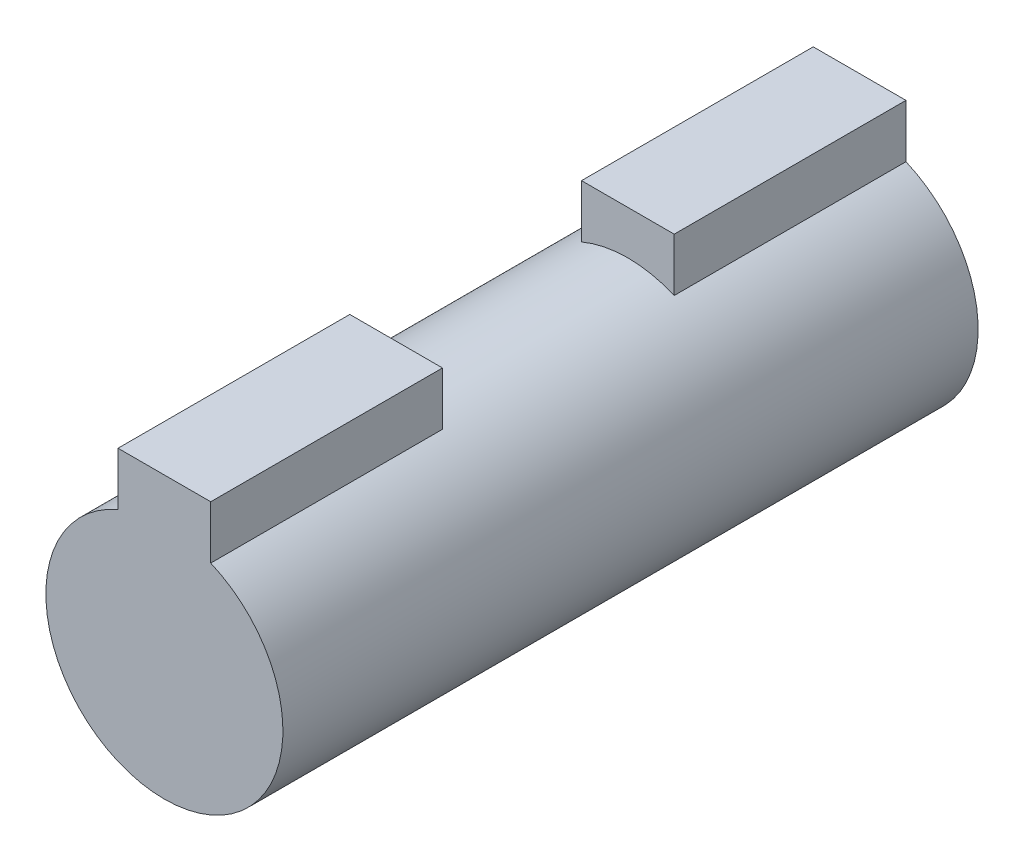
ISO-10303-21;
HEADER;
FILE_DESCRIPTION(('STEP AP214'),'2;1');
FILE_NAME('part.step','',(''),(''),'','','');
FILE_SCHEMA(('AUTOMOTIVE_DESIGN { 1 0 10303 214 1 1 1 1 }'));
ENDSEC;
DATA;
#1=APPLICATION_CONTEXT('core data for automotive mechanical design processes');
#2=APPLICATION_PROTOCOL_DEFINITION('international standard','automotive_design',2000,#1);
#3=PRODUCT_CONTEXT('',#1,'mechanical');
#4=PRODUCT('Part','Part','',(#3));
#5=PRODUCT_RELATED_PRODUCT_CATEGORY('part','',(#4));
#6=PRODUCT_DEFINITION_FORMATION('','',#4);
#7=PRODUCT_DEFINITION_CONTEXT('part definition',#1,'design');
#8=PRODUCT_DEFINITION('design','',#6,#7);
#9=PRODUCT_DEFINITION_SHAPE('','',#8);
#10=(LENGTH_UNIT() NAMED_UNIT(*) SI_UNIT(.MILLI.,.METRE.));
#11=(NAMED_UNIT(*) PLANE_ANGLE_UNIT() SI_UNIT($,.RADIAN.));
#12=(NAMED_UNIT(*) SI_UNIT($,.STERADIAN.) SOLID_ANGLE_UNIT());
#13=UNCERTAINTY_MEASURE_WITH_UNIT(LENGTH_MEASURE(1.E-05),#10,'distance_accuracy_value','');
#14=(GEOMETRIC_REPRESENTATION_CONTEXT(3) GLOBAL_UNCERTAINTY_ASSIGNED_CONTEXT((#13)) GLOBAL_UNIT_ASSIGNED_CONTEXT((#10,
#11,#12)) REPRESENTATION_CONTEXT('',''));
#15=CARTESIAN_POINT('',(0.,0.,0.));
#16=DIRECTION('',(0.,0.,1.));
#17=DIRECTION('',(1.,0.,0.));
#18=AXIS2_PLACEMENT_3D('',#15,#16,#17);
#19=CARTESIAN_POINT('',(2.00000000000002,7.00000000000001,30.));
#20=DIRECTION('',(-1.,0.,0.));
#21=DIRECTION('',(0.,-1.,0.));
#22=AXIS2_PLACEMENT_3D('',#19,#20,#21);
#23=PLANE('',#22);
#24=DIRECTION('',(0.,1.,0.));
#25=VECTOR('',#24,1.);
#26=CARTESIAN_POINT('',(2.00000000000001,7.00000000000001,9.99999999999999));
#27=LINE('',#26,#25);
#28=CARTESIAN_POINT('',(2.00000000000001,4.70724019463636,9.99999999999999));
#29=VERTEX_POINT('',#28);
#30=CARTESIAN_POINT('',(2.00000000000001,7.00000000000001,9.99999999999999));
#31=VERTEX_POINT('',#30);
#32=EDGE_CURVE('E162',#29,#31,#27,.T.);
#33=ORIENTED_EDGE('',*,*,#32,.F.);
#34=DIRECTION('',(0.,0.,-1.));
#35=VECTOR('',#34,1.);
#36=CARTESIAN_POINT('',(2.00000000000001,4.70724019463636,30.));
#37=LINE('',#36,#35);
#38=CARTESIAN_POINT('',(2.00000000000001,4.70724019463634,0.));
#39=VERTEX_POINT('',#38);
#40=EDGE_CURVE('E78',#29,#39,#37,.T.);
#41=ORIENTED_EDGE('',*,*,#40,.T.);
#42=DIRECTION('',(0.,1.,0.));
#43=VECTOR('',#42,1.);
#44=CARTESIAN_POINT('',(1.99999999999999,7.,0.));
#45=LINE('',#44,#43);
#46=CARTESIAN_POINT('',(1.99999999999999,7.,0.));
#47=VERTEX_POINT('',#46);
#48=EDGE_CURVE('E157',#39,#47,#45,.T.);
#49=ORIENTED_EDGE('',*,*,#48,.T.);
#50=DIRECTION('',(0.,0.,-1.));
#51=VECTOR('',#50,1.);
#52=CARTESIAN_POINT('',(2.00000000000002,7.00000000000001,30.));
#53=LINE('',#52,#51);
#54=EDGE_CURVE('E42',#31,#47,#53,.T.);
#55=ORIENTED_EDGE('',*,*,#54,.F.);
#56=EDGE_LOOP('',(#33,#41,#49,#55));
#57=FACE_BOUND('',#56,.T.);
#58=ADVANCED_FACE('F34',(#57),#23,.F.);
#59=CARTESIAN_POINT('',(2.00000000000002,7.00000000000001,30.));
#60=DIRECTION('',(0.,-1.,0.));
#61=DIRECTION('',(0.,0.,-1.));
#62=AXIS2_PLACEMENT_3D('',#59,#60,#61);
#63=PLANE('',#62);
#64=DIRECTION('',(-1.,0.,0.));
#65=VECTOR('',#64,1.);
#66=CARTESIAN_POINT('',(2.00000000000001,7.00000000000001,9.99999999999999));
#67=LINE('',#66,#65);
#68=CARTESIAN_POINT('',(-1.99999999999999,7.00000000000002,9.99999999999999));
#69=VERTEX_POINT('',#68);
#70=EDGE_CURVE('E169',#31,#69,#67,.T.);
#71=ORIENTED_EDGE('',*,*,#70,.F.);
#72=ORIENTED_EDGE('',*,*,#54,.T.);
#73=DIRECTION('',(-1.,0.,0.));
#74=VECTOR('',#73,1.);
#75=CARTESIAN_POINT('',(1.99999999999999,7.,0.));
#76=LINE('',#75,#74);
#77=CARTESIAN_POINT('',(-2.,7.,0.));
#78=VERTEX_POINT('',#77);
#79=EDGE_CURVE('E152',#47,#78,#76,.T.);
#80=ORIENTED_EDGE('',*,*,#79,.T.);
#81=DIRECTION('',(0.,0.,-1.));
#82=VECTOR('',#81,1.);
#83=CARTESIAN_POINT('',(-2.,7.00000000000001,30.));
#84=LINE('',#83,#82);
#85=EDGE_CURVE('E134',#69,#78,#84,.T.);
#86=ORIENTED_EDGE('',*,*,#85,.F.);
#87=EDGE_LOOP('',(#71,#72,#80,#86));
#88=FACE_BOUND('',#87,.T.);
#89=ADVANCED_FACE('F153',(#88),#63,.F.);
#90=CARTESIAN_POINT('',(-2.,7.00000000000001,30.));
#91=DIRECTION('',(1.,0.,0.));
#92=DIRECTION('',(0.,1.,0.));
#93=AXIS2_PLACEMENT_3D('',#90,#91,#92);
#94=PLANE('',#93);
#95=DIRECTION('',(0.,-1.,0.));
#96=VECTOR('',#95,1.);
#97=CARTESIAN_POINT('',(-1.99999999999999,7.00000000000002,9.99999999999999));
#98=LINE('',#97,#96);
#99=CARTESIAN_POINT('',(-2.,4.70724019463636,9.99999999999999));
#100=VERTEX_POINT('',#99);
#101=EDGE_CURVE('E117',#69,#100,#98,.T.);
#102=ORIENTED_EDGE('',*,*,#101,.F.);
#103=ORIENTED_EDGE('',*,*,#85,.T.);
#104=DIRECTION('',(0.,-1.,0.));
#105=VECTOR('',#104,1.);
#106=CARTESIAN_POINT('',(-2.,7.,0.));
#107=LINE('',#106,#105);
#108=CARTESIAN_POINT('',(-2.,4.70724019463636,0.));
#109=VERTEX_POINT('',#108);
#110=EDGE_CURVE('E147',#78,#109,#107,.T.);
#111=ORIENTED_EDGE('',*,*,#110,.T.);
#112=DIRECTION('',(0.,0.,-1.));
#113=VECTOR('',#112,1.);
#114=CARTESIAN_POINT('',(-2.,4.70724019463636,30.));
#115=LINE('',#114,#113);
#116=EDGE_CURVE('E128',#100,#109,#115,.T.);
#117=ORIENTED_EDGE('',*,*,#116,.F.);
#118=EDGE_LOOP('',(#102,#103,#111,#117));
#119=FACE_BOUND('',#118,.T.);
#120=ADVANCED_FACE('F144',(#119),#94,.F.);
#121=CARTESIAN_POINT('',(2.00000000000001,4.70724019463636,30.));
#122=VERTEX_POINT('',#121);
#123=CARTESIAN_POINT('',(2.,4.70724019463636,20.));
#124=VERTEX_POINT('',#123);
#125=EDGE_CURVE('E122',#122,#124,#37,.T.);
#126=ORIENTED_EDGE('',*,*,#125,.T.);
#127=DIRECTION('',(0.,1.,0.));
#128=VECTOR('',#127,1.);
#129=CARTESIAN_POINT('',(2.,7.00000000000003,20.));
#130=LINE('',#129,#128);
#131=CARTESIAN_POINT('',(2.,7.00000000000003,20.));
#132=VERTEX_POINT('',#131);
#133=EDGE_CURVE('E107',#124,#132,#130,.T.);
#134=ORIENTED_EDGE('',*,*,#133,.T.);
#135=CARTESIAN_POINT('',(2.00000000000002,7.00000000000001,30.));
#136=VERTEX_POINT('',#135);
#137=EDGE_CURVE('E11',#136,#132,#53,.T.);
#138=ORIENTED_EDGE('',*,*,#137,.F.);
#139=DIRECTION('',(0.,1.,0.));
#140=VECTOR('',#139,1.);
#141=CARTESIAN_POINT('',(2.00000000000002,7.00000000000001,30.));
#142=LINE('',#141,#140);
#143=EDGE_CURVE('E127',#122,#136,#142,.T.);
#144=ORIENTED_EDGE('',*,*,#143,.F.);
#145=EDGE_LOOP('',(#126,#134,#138,#144));
#146=FACE_BOUND('',#145,.T.);
#147=ADVANCED_FACE('F36',(#146),#23,.F.);
#148=ORIENTED_EDGE('',*,*,#137,.T.);
#149=DIRECTION('',(-1.,0.,0.));
#150=VECTOR('',#149,1.);
#151=CARTESIAN_POINT('',(2.,7.00000000000003,20.));
#152=LINE('',#151,#150);
#153=CARTESIAN_POINT('',(-2.,7.00000000000003,20.));
#154=VERTEX_POINT('',#153);
#155=EDGE_CURVE('E113',#132,#154,#152,.T.);
#156=ORIENTED_EDGE('',*,*,#155,.T.);
#157=CARTESIAN_POINT('',(-2.,7.00000000000001,30.));
#158=VERTEX_POINT('',#157);
#159=EDGE_CURVE('E135',#158,#154,#84,.T.);
#160=ORIENTED_EDGE('',*,*,#159,.F.);
#161=DIRECTION('',(-1.,0.,0.));
#162=VECTOR('',#161,1.);
#163=CARTESIAN_POINT('',(2.00000000000002,7.00000000000001,30.));
#164=LINE('',#163,#162);
#165=EDGE_CURVE('E85',#136,#158,#164,.T.);
#166=ORIENTED_EDGE('',*,*,#165,.F.);
#167=EDGE_LOOP('',(#148,#156,#160,#166));
#168=FACE_BOUND('',#167,.T.);
#169=ADVANCED_FACE('F176',(#168),#63,.F.);
#170=ORIENTED_EDGE('',*,*,#159,.T.);
#171=DIRECTION('',(0.,-1.,0.));
#172=VECTOR('',#171,1.);
#173=CARTESIAN_POINT('',(-2.,7.00000000000003,20.));
#174=LINE('',#173,#172);
#175=CARTESIAN_POINT('',(-2.,4.70724019463636,20.));
#176=VERTEX_POINT('',#175);
#177=EDGE_CURVE('E173',#154,#176,#174,.T.);
#178=ORIENTED_EDGE('',*,*,#177,.T.);
#179=CARTESIAN_POINT('',(-2.,4.70724019463636,30.));
#180=VERTEX_POINT('',#179);
#181=EDGE_CURVE('E125',#180,#176,#115,.T.);
#182=ORIENTED_EDGE('',*,*,#181,.F.);
#183=DIRECTION('',(0.,-1.,0.));
#184=VECTOR('',#183,1.);
#185=CARTESIAN_POINT('',(-2.,7.00000000000001,30.));
#186=LINE('',#185,#184);
#187=EDGE_CURVE('E164',#158,#180,#186,.T.);
#188=ORIENTED_EDGE('',*,*,#187,.F.);
#189=EDGE_LOOP('',(#170,#178,#182,#188));
#190=FACE_BOUND('',#189,.T.);
#191=ADVANCED_FACE('F175',(#190),#94,.F.);
#192=CARTESIAN_POINT('',(0.,0.,30.));
#193=DIRECTION('',(0.,0.,-1.));
#194=DIRECTION('',(-1.,0.,0.));
#195=AXIS2_PLACEMENT_3D('',#192,#193,#194);
#196=CYLINDRICAL_SURFACE('',#195,5.1145);
#197=ORIENTED_EDGE('',*,*,#40,.F.);
#198=CARTESIAN_POINT('',(0.,0.,9.99999999999999));
#199=DIRECTION('',(0.,0.,1.));
#200=DIRECTION('',(1.,0.,0.));
#201=AXIS2_PLACEMENT_3D('',#198,#199,#200);
#202=CIRCLE('',#201,5.1145);
#203=EDGE_CURVE('E49',#29,#100,#202,.T.);
#204=ORIENTED_EDGE('',*,*,#203,.T.);
#205=ORIENTED_EDGE('',*,*,#116,.T.);
#206=CARTESIAN_POINT('',(0.,0.,0.));
#207=DIRECTION('',(0.,0.,1.));
#208=DIRECTION('',(1.,0.,0.));
#209=AXIS2_PLACEMENT_3D('',#206,#207,#208);
#210=CIRCLE('',#209,5.1145);
#211=EDGE_CURVE('E132',#109,#39,#210,.T.);
#212=ORIENTED_EDGE('',*,*,#211,.T.);
#213=EDGE_LOOP('',(#197,#204,#205,#212));
#214=FACE_BOUND('',#213,.T.);
#215=ORIENTED_EDGE('',*,*,#181,.T.);
#216=CARTESIAN_POINT('',(0.,0.,20.));
#217=DIRECTION('',(0.,0.,1.));
#218=DIRECTION('',(1.,0.,0.));
#219=AXIS2_PLACEMENT_3D('',#216,#217,#218);
#220=CIRCLE('',#219,5.1145);
#221=EDGE_CURVE('E110',#124,#176,#220,.T.);
#222=ORIENTED_EDGE('',*,*,#221,.F.);
#223=ORIENTED_EDGE('',*,*,#125,.F.);
#224=CARTESIAN_POINT('',(0.,0.,30.));
#225=DIRECTION('',(0.,0.,1.));
#226=DIRECTION('',(1.,0.,0.));
#227=AXIS2_PLACEMENT_3D('',#224,#225,#226);
#228=CIRCLE('',#227,5.1145);
#229=EDGE_CURVE('E58',#180,#122,#228,.T.);
#230=ORIENTED_EDGE('',*,*,#229,.F.);
#231=EDGE_LOOP('',(#215,#222,#223,#230));
#232=FACE_BOUND('',#231,.T.);
#233=ADVANCED_FACE('F121',(#214,#232),#196,.T.);
#234=CARTESIAN_POINT('',(0.,0.,30.));
#235=DIRECTION('',(0.,0.,1.));
#236=DIRECTION('',(1.,0.,0.));
#237=AXIS2_PLACEMENT_3D('',#234,#235,#236);
#238=PLANE('',#237);
#239=ORIENTED_EDGE('',*,*,#143,.T.);
#240=ORIENTED_EDGE('',*,*,#165,.T.);
#241=ORIENTED_EDGE('',*,*,#187,.T.);
#242=ORIENTED_EDGE('',*,*,#229,.T.);
#243=EDGE_LOOP('',(#239,#240,#241,#242));
#244=FACE_BOUND('',#243,.T.);
#245=ADVANCED_FACE('F177',(#244),#238,.T.);
#246=CARTESIAN_POINT('',(0.,0.,0.));
#247=DIRECTION('',(0.,0.,1.));
#248=DIRECTION('',(1.,0.,0.));
#249=AXIS2_PLACEMENT_3D('',#246,#247,#248);
#250=PLANE('',#249);
#251=ORIENTED_EDGE('',*,*,#48,.F.);
#252=ORIENTED_EDGE('',*,*,#211,.F.);
#253=ORIENTED_EDGE('',*,*,#110,.F.);
#254=ORIENTED_EDGE('',*,*,#79,.F.);
#255=EDGE_LOOP('',(#251,#252,#253,#254));
#256=FACE_BOUND('',#255,.T.);
#257=ADVANCED_FACE('F159',(#256),#250,.F.);
#258=CARTESIAN_POINT('',(0.,0.,9.99999999999999));
#259=DIRECTION('',(0.,0.,1.));
#260=DIRECTION('',(1.,0.,0.));
#261=AXIS2_PLACEMENT_3D('',#258,#259,#260);
#262=PLANE('',#261);
#263=ORIENTED_EDGE('',*,*,#32,.T.);
#264=ORIENTED_EDGE('',*,*,#70,.T.);
#265=ORIENTED_EDGE('',*,*,#101,.T.);
#266=ORIENTED_EDGE('',*,*,#203,.F.);
#267=EDGE_LOOP('',(#263,#264,#265,#266));
#268=FACE_BOUND('',#267,.T.);
#269=ADVANCED_FACE('F184',(#268),#262,.T.);
#270=CARTESIAN_POINT('',(0.,0.,20.));
#271=DIRECTION('',(0.,0.,1.));
#272=DIRECTION('',(1.,0.,0.));
#273=AXIS2_PLACEMENT_3D('',#270,#271,#272);
#274=PLANE('',#273);
#275=ORIENTED_EDGE('',*,*,#221,.T.);
#276=ORIENTED_EDGE('',*,*,#177,.F.);
#277=ORIENTED_EDGE('',*,*,#155,.F.);
#278=ORIENTED_EDGE('',*,*,#133,.F.);
#279=EDGE_LOOP('',(#275,#276,#277,#278));
#280=FACE_BOUND('',#279,.T.);
#281=ADVANCED_FACE('F109',(#280),#274,.F.);
#282=CLOSED_SHELL('',(#58,#89,#120,#147,#169,#191,#233,#245,#257,#269,#281));
#283=MANIFOLD_SOLID_BREP('B2',#282);
#284=ADVANCED_BREP_SHAPE_REPRESENTATION('',(#18,#283),#14);
#285=SHAPE_DEFINITION_REPRESENTATION(#9,#284);
ENDSEC;
END-ISO-10303-21;
